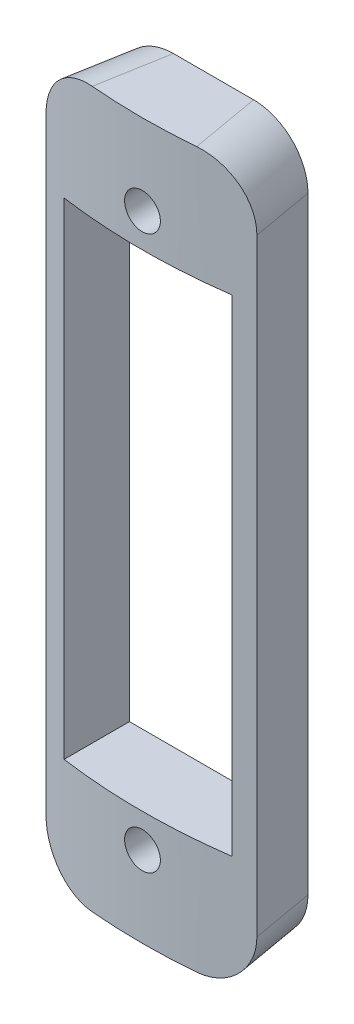
ISO-10303-21;
HEADER;
FILE_DESCRIPTION(('STEP AP214'),'2;1');
FILE_NAME('part.step','',(''),(''),'','','');
FILE_SCHEMA(('AUTOMOTIVE_DESIGN { 1 0 10303 214 1 1 1 1 }'));
ENDSEC;
DATA;
#1=APPLICATION_CONTEXT('core data for automotive mechanical design processes');
#2=APPLICATION_PROTOCOL_DEFINITION('international standard','automotive_design',2000,#1);
#3=PRODUCT_CONTEXT('',#1,'mechanical');
#4=PRODUCT('Part','Part','',(#3));
#5=PRODUCT_RELATED_PRODUCT_CATEGORY('part','',(#4));
#6=PRODUCT_DEFINITION_FORMATION('','',#4);
#7=PRODUCT_DEFINITION_CONTEXT('part definition',#1,'design');
#8=PRODUCT_DEFINITION('design','',#6,#7);
#9=PRODUCT_DEFINITION_SHAPE('','',#8);
#10=(LENGTH_UNIT() NAMED_UNIT(*) SI_UNIT(.MILLI.,.METRE.));
#11=(NAMED_UNIT(*) PLANE_ANGLE_UNIT() SI_UNIT($,.RADIAN.));
#12=(NAMED_UNIT(*) SI_UNIT($,.STERADIAN.) SOLID_ANGLE_UNIT());
#13=UNCERTAINTY_MEASURE_WITH_UNIT(LENGTH_MEASURE(1.E-05),#10,'distance_accuracy_value','');
#14=(GEOMETRIC_REPRESENTATION_CONTEXT(3) GLOBAL_UNCERTAINTY_ASSIGNED_CONTEXT((#13)) GLOBAL_UNIT_ASSIGNED_CONTEXT((#10,
#11,#12)) REPRESENTATION_CONTEXT('',''));
#15=CARTESIAN_POINT('',(0.,0.,0.));
#16=DIRECTION('',(0.,0.,1.));
#17=DIRECTION('',(1.,0.,0.));
#18=AXIS2_PLACEMENT_3D('',#15,#16,#17);
#19=CARTESIAN_POINT('',(5.8992627157898,40.,-0.516118610792767));
#20=DIRECTION('',(0.,-1.,0.));
#21=DIRECTION('',(0.,0.,-1.));
#22=AXIS2_PLACEMENT_3D('',#19,#20,#21);
#23=PLANE('',#22);
#24=CARTESIAN_POINT('',(0.,40.,-33.9725));
#25=DIRECTION('',(0.,-1.,0.));
#26=DIRECTION('',(0.,0.,-1.));
#27=AXIS2_PLACEMENT_3D('',#24,#25,#26);
#28=CIRCLE('',#27,33.9725);
#29=CARTESIAN_POINT('',(2.92179298812824,40.,-0.125877096311004));
#30=VERTEX_POINT('',#29);
#31=CARTESIAN_POINT('',(-2.92179298812824,40.,-0.125877096311004));
#32=VERTEX_POINT('',#31);
#33=EDGE_CURVE('E378',#30,#32,#28,.T.);
#34=ORIENTED_EDGE('',*,*,#33,.F.);
#35=DIRECTION('',(0.173648177666931,0.,0.984807753012208));
#36=VECTOR('',#35,1.);
#37=CARTESIAN_POINT('',(2.94483945675318,40.,0.00482592220802487));
#38=LINE('',#37,#36);
#39=CARTESIAN_POINT('',(2.24119605373601,40.,-3.98573411681718));
#40=VERTEX_POINT('',#39);
#41=EDGE_CURVE('E340',#30,#40,#38,.F.);
#42=ORIENTED_EDGE('',*,*,#41,.T.);
#43=DIRECTION('',(-1.,0.,0.));
#44=VECTOR('',#43,1.);
#45=CARTESIAN_POINT('',(5.55196636045594,40.,-3.98573411681718));
#46=LINE('',#45,#44);
#47=CARTESIAN_POINT('',(-2.24119605373601,40.,-3.98573411681718));
#48=VERTEX_POINT('',#47);
#49=EDGE_CURVE('E227',#40,#48,#46,.T.);
#50=ORIENTED_EDGE('',*,*,#49,.T.);
#51=DIRECTION('',(-0.173648177666931,0.,0.984807753012208));
#52=VECTOR('',#51,1.);
#53=CARTESIAN_POINT('',(-2.94483945675318,40.,0.00482592220802562));
#54=LINE('',#53,#52);
#55=EDGE_CURVE('E330',#48,#32,#54,.T.);
#56=ORIENTED_EDGE('',*,*,#55,.T.);
#57=EDGE_LOOP('',(#34,#42,#50,#56));
#58=FACE_BOUND('',#57,.T.);
#59=ADVANCED_FACE('F92',(#58),#23,.F.);
#60=CARTESIAN_POINT('',(5.8992627157898,0.,-0.516118610792767));
#61=DIRECTION('',(0.,1.,0.));
#62=DIRECTION('',(0.,0.,1.));
#63=AXIS2_PLACEMENT_3D('',#60,#61,#62);
#64=PLANE('',#63);
#65=DIRECTION('',(1.,0.,0.));
#66=VECTOR('',#65,1.);
#67=CARTESIAN_POINT('',(-5.55196636045594,0.,-3.98573411681718));
#68=LINE('',#67,#66);
#69=CARTESIAN_POINT('',(-2.24119605373601,0.,-3.98573411681718));
#70=VERTEX_POINT('',#69);
#71=CARTESIAN_POINT('',(2.24119605373601,0.,-3.98573411681718));
#72=VERTEX_POINT('',#71);
#73=EDGE_CURVE('E223',#70,#72,#68,.T.);
#74=ORIENTED_EDGE('',*,*,#73,.T.);
#75=DIRECTION('',(-0.173648177666931,0.,-0.984807753012208));
#76=VECTOR('',#75,1.);
#77=CARTESIAN_POINT('',(2.94483945675318,0.,0.00482592220802497));
#78=LINE('',#77,#76);
#79=CARTESIAN_POINT('',(2.92179298812824,0.,-0.125877096311004));
#80=VERTEX_POINT('',#79);
#81=EDGE_CURVE('E358',#72,#80,#78,.F.);
#82=ORIENTED_EDGE('',*,*,#81,.T.);
#83=CARTESIAN_POINT('',(0.,0.,-33.9725));
#84=DIRECTION('',(0.,-1.,0.));
#85=DIRECTION('',(0.,0.,-1.));
#86=AXIS2_PLACEMENT_3D('',#83,#84,#85);
#87=CIRCLE('',#86,33.9725);
#88=CARTESIAN_POINT('',(-2.92179298812824,0.,-0.125877096311004));
#89=VERTEX_POINT('',#88);
#90=EDGE_CURVE('E382',#80,#89,#87,.T.);
#91=ORIENTED_EDGE('',*,*,#90,.T.);
#92=DIRECTION('',(0.173648177666931,0.,-0.984807753012208));
#93=VECTOR('',#92,1.);
#94=CARTESIAN_POINT('',(-2.33305263035662,0.,-3.46478958381639));
#95=LINE('',#94,#93);
#96=EDGE_CURVE('E354',#89,#70,#95,.T.);
#97=ORIENTED_EDGE('',*,*,#96,.T.);
#98=EDGE_LOOP('',(#74,#82,#91,#97));
#99=FACE_BOUND('',#98,.T.);
#100=ADVANCED_FACE('F305',(#99),#64,.F.);
#101=CARTESIAN_POINT('',(0.,0.,-3.98573411681718));
#102=DIRECTION('',(0.,0.,1.));
#103=DIRECTION('',(1.,0.,0.));
#104=AXIS2_PLACEMENT_3D('',#101,#102,#103);
#105=PLANE('',#104);
#106=DIRECTION('',(0.,-1.,0.));
#107=VECTOR('',#106,1.);
#108=CARTESIAN_POINT('',(-4.7,33.6,-3.98573411681718));
#109=LINE('',#108,#107);
#110=CARTESIAN_POINT('',(-4.7,33.6,-3.98573411681718));
#111=VERTEX_POINT('',#110);
#112=CARTESIAN_POINT('',(-4.7,6.4,-3.98573411681718));
#113=VERTEX_POINT('',#112);
#114=EDGE_CURVE('E209',#111,#113,#109,.T.);
#115=ORIENTED_EDGE('',*,*,#114,.T.);
#116=DIRECTION('',(1.,0.,0.));
#117=VECTOR('',#116,1.);
#118=CARTESIAN_POINT('',(4.7,6.4,-3.98573411681718));
#119=LINE('',#118,#117);
#120=CARTESIAN_POINT('',(4.7,6.4,-3.98573411681718));
#121=VERTEX_POINT('',#120);
#122=EDGE_CURVE('E186',#113,#121,#119,.T.);
#123=ORIENTED_EDGE('',*,*,#122,.T.);
#124=DIRECTION('',(0.,1.,0.));
#125=VECTOR('',#124,1.);
#126=CARTESIAN_POINT('',(4.7,6.4,-3.98573411681718));
#127=LINE('',#126,#125);
#128=CARTESIAN_POINT('',(4.7,33.6,-3.98573411681718));
#129=VERTEX_POINT('',#128);
#130=EDGE_CURVE('E197',#121,#129,#127,.T.);
#131=ORIENTED_EDGE('',*,*,#130,.T.);
#132=DIRECTION('',(-1.,0.,0.));
#133=VECTOR('',#132,1.);
#134=CARTESIAN_POINT('',(-4.7,33.6,-3.98573411681718));
#135=LINE('',#134,#133);
#136=EDGE_CURVE('E204',#129,#111,#135,.T.);
#137=ORIENTED_EDGE('',*,*,#136,.T.);
#138=EDGE_LOOP('',(#115,#123,#131,#137));
#139=FACE_BOUND('',#138,.T.);
#140=CARTESIAN_POINT('',(0.,4.52,-3.98573411681718));
#141=DIRECTION('',(0.,0.,1.));
#142=DIRECTION('',(1.,0.,0.));
#143=AXIS2_PLACEMENT_3D('',#140,#141,#142);
#144=CIRCLE('',#143,1.);
#145=CARTESIAN_POINT('',(1.,4.52,-3.98573411681718));
#146=VERTEX_POINT('',#145);
#147=EDGE_CURVE('E211',#146,#146,#144,.T.);
#148=ORIENTED_EDGE('',*,*,#147,.T.);
#149=EDGE_LOOP('',(#148));
#150=FACE_BOUND('',#149,.T.);
#151=CARTESIAN_POINT('',(0.,35.48,-3.98573411681718));
#152=DIRECTION('',(0.,0.,1.));
#153=DIRECTION('',(1.,0.,0.));
#154=AXIS2_PLACEMENT_3D('',#151,#152,#153);
#155=CIRCLE('',#154,1.);
#156=CARTESIAN_POINT('',(1.,35.48,-3.98573411681718));
#157=VERTEX_POINT('',#156);
#158=EDGE_CURVE('E215',#157,#157,#155,.T.);
#159=ORIENTED_EDGE('',*,*,#158,.T.);
#160=EDGE_LOOP('',(#159));
#161=FACE_BOUND('',#160,.T.);
#162=ORIENTED_EDGE('',*,*,#49,.F.);
#163=CARTESIAN_POINT('',(2.24119605373601,37.,-3.98573411681718));
#164=DIRECTION('',(0.,0.,1.));
#165=DIRECTION('',(1.,0.,0.));
#166=AXIS2_PLACEMENT_3D('',#163,#164,#165);
#167=ELLIPSE('',#166,3.04627983565724,3.);
#168=CARTESIAN_POINT('',(5.28747588939325,37.,-3.98573411681718));
#169=VERTEX_POINT('',#168);
#170=EDGE_CURVE('E351',#40,#169,#167,.F.);
#171=ORIENTED_EDGE('',*,*,#170,.T.);
#172=DIRECTION('',(0.,1.,0.));
#173=VECTOR('',#172,1.);
#174=CARTESIAN_POINT('',(5.28747588939325,0.,-3.98573411681718));
#175=LINE('',#174,#173);
#176=CARTESIAN_POINT('',(5.28747588939325,3.,-3.98573411681718));
#177=VERTEX_POINT('',#176);
#178=EDGE_CURVE('E375',#177,#169,#175,.T.);
#179=ORIENTED_EDGE('',*,*,#178,.F.);
#180=CARTESIAN_POINT('',(2.24119605373601,3.,-3.98573411681718));
#181=DIRECTION('',(0.,0.,1.));
#182=DIRECTION('',(-1.,0.,0.));
#183=AXIS2_PLACEMENT_3D('',#180,#181,#182);
#184=ELLIPSE('',#183,3.04627983565724,3.);
#185=EDGE_CURVE('E348',#177,#72,#184,.F.);
#186=ORIENTED_EDGE('',*,*,#185,.T.);
#187=ORIENTED_EDGE('',*,*,#73,.F.);
#188=CARTESIAN_POINT('',(-2.24119605373601,3.,-3.98573411681718));
#189=DIRECTION('',(0.,0.,1.));
#190=DIRECTION('',(-1.,0.,0.));
#191=AXIS2_PLACEMENT_3D('',#188,#189,#190);
#192=ELLIPSE('',#191,3.04627983565724,3.);
#193=CARTESIAN_POINT('',(-5.28747588939325,3.,-3.98573411681718));
#194=VERTEX_POINT('',#193);
#195=EDGE_CURVE('E115',#70,#194,#192,.F.);
#196=ORIENTED_EDGE('',*,*,#195,.T.);
#197=DIRECTION('',(0.,1.,0.));
#198=VECTOR('',#197,1.);
#199=CARTESIAN_POINT('',(-5.28747588939325,0.,-3.98573411681718));
#200=LINE('',#199,#198);
#201=CARTESIAN_POINT('',(-5.28747588939325,37.,-3.98573411681718));
#202=VERTEX_POINT('',#201);
#203=EDGE_CURVE('E402',#194,#202,#200,.T.);
#204=ORIENTED_EDGE('',*,*,#203,.T.);
#205=CARTESIAN_POINT('',(-2.24119605373601,37.,-3.98573411681718));
#206=DIRECTION('',(0.,0.,1.));
#207=DIRECTION('',(1.,0.,0.));
#208=AXIS2_PLACEMENT_3D('',#205,#206,#207);
#209=ELLIPSE('',#208,3.04627983565724,3.);
#210=EDGE_CURVE('E343',#202,#48,#209,.F.);
#211=ORIENTED_EDGE('',*,*,#210,.T.);
#212=EDGE_LOOP('',(#162,#171,#179,#186,#187,#196,#204,#211));
#213=FACE_BOUND('',#212,.T.);
#214=ADVANCED_FACE('F206',(#139,#150,#161,#213),#105,.F.);
#215=CARTESIAN_POINT('',(0.,0.,-33.9725));
#216=DIRECTION('',(0.,-1.,0.));
#217=DIRECTION('',(0.,0.,-1.));
#218=AXIS2_PLACEMENT_3D('',#215,#216,#217);
#219=CYLINDRICAL_SURFACE('',#218,33.9725);
#220=CARTESIAN_POINT('',(1.,35.48,-0.0147209758942016));
#221=CARTESIAN_POINT('',(0.999997513642162,35.4238426172876,-0.0147207772486396));
#222=CARTESIAN_POINT('',(0.995253644364402,35.3676448248555,-0.0145801748343808));
#223=CARTESIAN_POINT('',(0.976395740182226,35.2567978521181,-0.0140328208042375));
#224=CARTESIAN_POINT('',(0.962270509336456,35.2021506036215,-0.0136257511883826));
#225=CARTESIAN_POINT('',(0.925053147042624,35.0960265966731,-0.0125916153020489));
#226=CARTESIAN_POINT('',(0.9019653984144,35.0445483027836,-0.0119646565754347));
#227=CARTESIAN_POINT('',(0.847484652327377,34.9462125523766,-0.0105615256804575));
#228=CARTESIAN_POINT('',(0.816093683681188,34.8993539709106,-0.00978538997471263));
#229=CARTESIAN_POINT('',(0.745881165792307,34.8115525298163,-0.00817095606510032));
#230=CARTESIAN_POINT('',(0.707056832093307,34.7706118971037,-0.00733263463946269));
#231=CARTESIAN_POINT('',(0.623084481996299,34.6958272288234,-0.00568852558756451));
#232=CARTESIAN_POINT('',(0.577936214021219,34.6619834757158,-0.00488273925725016));
#233=CARTESIAN_POINT('',(0.48258951163078,34.6023499340298,-0.00339442114617365));
#234=CARTESIAN_POINT('',(0.432390255699609,34.5765614584071,-0.00271190946598493));
#235=CARTESIAN_POINT('',(0.328372412134007,34.5337790693573,-0.0015472558635044));
#236=CARTESIAN_POINT('',(0.274553838739761,34.5167851213305,-0.00106511315291554));
#237=CARTESIAN_POINT('',(0.164841683600013,34.4920789082108,-0.000355671617623023));
#238=CARTESIAN_POINT('',(0.108948711833175,34.4843639365717,-0.000128298481557475));
#239=CARTESIAN_POINT('',(-0.00333944496895131,34.4784263391499,4.62223614167893E-05));
#240=CARTESIAN_POINT('',(-0.0597346280409103,34.4802036762745,-6.62883665438905E-06));
#241=CARTESIAN_POINT('',(-0.17140801612731,34.4931979550707,-0.000386535316670693));
#242=CARTESIAN_POINT('',(-0.226686561614122,34.5044119735332,-0.000713505684362299));
#243=CARTESIAN_POINT('',(-0.334576152588927,34.535956768739,-0.00160470174853287));
#244=CARTESIAN_POINT('',(-0.387187192328861,34.5562875651266,-0.00216892795623681));
#245=CARTESIAN_POINT('',(-0.488257728179094,34.6054921504709,-0.0034711899241181));
#246=CARTESIAN_POINT('',(-0.536716571759385,34.6343672790309,-0.00420925293519447));
#247=CARTESIAN_POINT('',(-0.628099981967729,34.6998398694153,-0.00577600946583619));
#248=CARTESIAN_POINT('',(-0.671024536502323,34.7364373481138,-0.00660470318343931));
#249=CARTESIAN_POINT('',(-0.750137940842107,34.8163323177066,-0.00825969989522234));
#250=CARTESIAN_POINT('',(-0.78632422877812,34.8596323454792,-0.00908600186300282));
#251=CARTESIAN_POINT('',(-0.850914176343981,34.951694330728,-0.0106427406146315));
#252=CARTESIAN_POINT('',(-0.879317834704575,35.000456289095,-0.0113731773828452));
#253=CARTESIAN_POINT('',(-0.927535961753667,35.102059391384,-0.0126558021857537));
#254=CARTESIAN_POINT('',(-0.947350347722275,35.1549005745856,-0.0132079885037758));
#255=CARTESIAN_POINT('',(-0.977825821264725,35.263161496898,-0.0140717779453725));
#256=CARTESIAN_POINT('',(-0.988486932879301,35.318581229236,-0.0143833817008281));
#257=CARTESIAN_POINT('',(-1.00035008363069,35.4304037897771,-0.0147307570283451));
#258=CARTESIAN_POINT('',(-1.00155567165314,35.4868062411754,-0.0147666320879225));
#259=CARTESIAN_POINT('',(-0.994482800735035,35.5990127428704,-0.014558774916731));
#260=CARTESIAN_POINT('',(-0.986204352358743,35.6548167938335,-0.0143150429974158));
#261=CARTESIAN_POINT('',(-0.96040134386475,35.7642325101869,-0.0135755421869516));
#262=CARTESIAN_POINT('',(-0.942878396219444,35.817844556161,-0.0130798172502507));
#263=CARTESIAN_POINT('',(-0.899085439918979,35.9213660869634,-0.0118922511416479));
#264=CARTESIAN_POINT('',(-0.872815414361654,35.9712755646369,-0.0112004095907861));
#265=CARTESIAN_POINT('',(-0.812264869418253,36.0659915505663,-0.00969834913244756));
#266=CARTESIAN_POINT('',(-0.777981959834502,36.1107965302361,-0.00888809493022906));
#267=CARTESIAN_POINT('',(-0.702382324832499,36.1940163135018,-0.0072406750304402));
#268=CARTESIAN_POINT('',(-0.661065582024384,36.2324311012986,-0.00640350926634009));
#269=CARTESIAN_POINT('',(-0.572555918292329,36.3017918798079,-0.00479633946982905));
#270=CARTESIAN_POINT('',(-0.525361203365883,36.3327355817778,-0.00402635606452948));
#271=CARTESIAN_POINT('',(-0.426444448105355,36.3862601549503,-0.00264064258107694));
#272=CARTESIAN_POINT('',(-0.374722417768455,36.408841044619,-0.00202491216231541));
#273=CARTESIAN_POINT('',(-0.268227863127471,36.4449949927357,-0.00101721247804147));
#274=CARTESIAN_POINT('',(-0.213455842782291,36.4585695345703,-0.000625206365600659));
#275=CARTESIAN_POINT('',(-0.102408937124751,36.4763303213247,-0.000108998492124729));
#276=CARTESIAN_POINT('',(-0.0461340529782502,36.4805165735273,1.52034766553932E-05));
#277=CARTESIAN_POINT('',(0.0662982393001708,36.4793817753985,-1.81955587839371E-05));
#278=CARTESIAN_POINT('',(0.122455683907081,36.4740643321761,-0.000175689645835085));
#279=CARTESIAN_POINT('',(0.233080406536676,36.4540805020248,-0.000754524326980173));
#280=CARTESIAN_POINT('',(0.287547681211115,36.4394140965768,-0.00117586544372284));
#281=CARTESIAN_POINT('',(0.393247354690003,36.4011491485958,-0.00223493383786617));
#282=CARTESIAN_POINT('',(0.444479699086256,36.3775504558777,-0.00287266475357113));
#283=CARTESIAN_POINT('',(0.54225419556959,36.3220920996906,-0.00429265365963366));
#284=CARTESIAN_POINT('',(0.588796517732883,36.2902327359314,-0.00507490640621953));
#285=CARTESIAN_POINT('',(0.675886279350094,36.2191469538439,-0.0066960931632711));
#286=CARTESIAN_POINT('',(0.716432078781537,36.1799185267443,-0.00753504258896107));
#287=CARTESIAN_POINT('',(0.790373505772317,36.0952000725833,-0.00917510750592588));
#288=CARTESIAN_POINT('',(0.823767360094714,36.0497084972338,-0.00997621357611936));
#289=CARTESIAN_POINT('',(0.882462444289374,35.9537376478785,-0.0114505230955954));
#290=CARTESIAN_POINT('',(0.907758464509005,35.9032551902633,-0.0121236440944888));
#291=CARTESIAN_POINT('',(0.949486476358077,35.7987968579843,-0.0132645619209187));
#292=CARTESIAN_POINT('',(0.965929040217795,35.7448252365467,-0.0137326035161325));
#293=CARTESIAN_POINT('',(0.985125041780507,35.6554271446126,-0.0142854468762356));
#294=CARTESIAN_POINT('',(0.990696134445735,35.6205809631187,-0.0144480609164975));
#295=CARTESIAN_POINT('',(0.998134393496357,35.5504951632566,-0.014665887764978));
#296=CARTESIAN_POINT('',(1.0000015609328,35.5152555450001,-0.0147211006036736));
#297=CARTESIAN_POINT('',(1.,35.48,-0.0147209758942016));
#298=B_SPLINE_CURVE_WITH_KNOTS('',3,(#220,#221,#222,#223,#224,#225,#226,#227,#228,#229,#230,
#231,#232,#233,#234,#235,#236,#237,#238,#239,#240,#241,#242,#243,#244,#245,#246,#247,#248,#249,
#250,#251,#252,#253,#254,#255,#256,#257,#258,#259,#260,#261,#262,#263,#264,#265,#266,#267,#268,
#269,#270,#271,#272,#273,#274,#275,#276,#277,#278,#279,#280,#281,#282,#283,#284,#285,#286,#287,
#288,#289,#290,#291,#292,#293,#294,#295,#296,#297),.UNSPECIFIED.,.T.,.F.,(4,2,2,2,2,2,2,2,2,2,2,
2,2,2,2,2,2,2,2,2,2,2,2,2,2,2,2,2,2,2,2,2,2,2,2,2,2,2,4),(0.,0.168343460933306,
0.336888188856507,0.505350599229996,0.673771885383047,0.842256384156517,1.01074758744013,
1.17926623933845,1.34778422823983,1.51625305089438,1.68472121523134,1.85313721223928,
2.021553572142,2.18999635081987,2.35843949757052,2.52694655573396,2.69545364137888,
2.86396234981295,3.03247061566382,3.200915633278,3.3693604632617,3.53777592195409,
3.70619170608116,3.87465779193781,4.04312429430204,4.21164234052683,4.38016001464085,
4.54864992622871,4.71713970711302,4.88556555161147,5.05399172974199,5.22242073987317,
5.39084363999399,5.55931251818855,5.72782311794003,5.89644191027871,6.06485889977861,
6.17054477507947,6.27623062039023),.UNSPECIFIED.);
#299=CARTESIAN_POINT('',(1.,35.48,-0.0147209758942016));
#300=VERTEX_POINT('',#299);
#301=EDGE_CURVE('E261',#300,#300,#298,.T.);
#302=ORIENTED_EDGE('',*,*,#301,.T.);
#303=EDGE_LOOP('',(#302));
#304=FACE_BOUND('',#303,.T.);
#305=CARTESIAN_POINT('',(1.,4.52,-0.0147209758942016));
#306=CARTESIAN_POINT('',(0.999997513642161,4.46384261728761,-0.0147207772486396));
#307=CARTESIAN_POINT('',(0.995253644364402,4.40764482485545,-0.0145801748343808));
#308=CARTESIAN_POINT('',(0.976395740182224,4.29679785211811,-0.0140328208042375));
#309=CARTESIAN_POINT('',(0.962270509336455,4.24215060362154,-0.0136257511883826));
#310=CARTESIAN_POINT('',(0.925053147042623,4.13602659667314,-0.0125916153020489));
#311=CARTESIAN_POINT('',(0.901965398414401,4.0845483027836,-0.0119646565754347));
#312=CARTESIAN_POINT('',(0.847484652327378,3.98621255237662,-0.0105615256804575));
#313=CARTESIAN_POINT('',(0.816093683681188,3.93935397091065,-0.00978538997471265));
#314=CARTESIAN_POINT('',(0.745881165792305,3.85155252981631,-0.0081709560651003));
#315=CARTESIAN_POINT('',(0.707056832093305,3.81061189710367,-0.00733263463946267));
#316=CARTESIAN_POINT('',(0.623084481996297,3.73582722882344,-0.0056885255875645));
#317=CARTESIAN_POINT('',(0.577936214021218,3.70198347571584,-0.00488273925725016));
#318=CARTESIAN_POINT('',(0.482589511630779,3.64234993402976,-0.00339442114617367));
#319=CARTESIAN_POINT('',(0.432390255699608,3.6165614584071,-0.00271190946598494));
#320=CARTESIAN_POINT('',(0.328372412134006,3.57377906935732,-0.00154725586350442));
#321=CARTESIAN_POINT('',(0.27455383873976,3.55678512133047,-0.00106511315291557));
#322=CARTESIAN_POINT('',(0.164841683600013,3.5320789082108,-0.000355671617623064));
#323=CARTESIAN_POINT('',(0.108948711833174,3.52436393657167,-0.000128298481557518));
#324=CARTESIAN_POINT('',(-0.00333944496895248,3.51842633914986,4.62223614167413E-05));
#325=CARTESIAN_POINT('',(-0.0597346280409114,3.52020367627451,-6.62883665443837E-06));
#326=CARTESIAN_POINT('',(-0.17140801612731,3.53319795507072,-0.000386535316670734));
#327=CARTESIAN_POINT('',(-0.226686561614122,3.54441197353321,-0.00071350568436233));
#328=CARTESIAN_POINT('',(-0.334576152588927,3.57595676873903,-0.00160470174853289));
#329=CARTESIAN_POINT('',(-0.387187192328861,3.59628756512665,-0.00216892795623684));
#330=CARTESIAN_POINT('',(-0.488257728179093,3.64549215047087,-0.00347118992411817));
#331=CARTESIAN_POINT('',(-0.536716571759385,3.67436727903095,-0.00420925293519457));
#332=CARTESIAN_POINT('',(-0.628099981967728,3.73983986941527,-0.00577600946583631));
#333=CARTESIAN_POINT('',(-0.671024536502322,3.77643734811383,-0.00660470318343941));
#334=CARTESIAN_POINT('',(-0.750137940842106,3.85633231770661,-0.00825969989522231));
#335=CARTESIAN_POINT('',(-0.786324228778117,3.89963234547919,-0.00908600186300266));
#336=CARTESIAN_POINT('',(-0.850914176343978,3.99169433072799,-0.0106427406146311));
#337=CARTESIAN_POINT('',(-0.879317834704573,4.04045628909497,-0.0113731773828448));
#338=CARTESIAN_POINT('',(-0.927535961753666,4.14205939138395,-0.0126558021857541));
#339=CARTESIAN_POINT('',(-0.947350347722274,4.19490057458557,-0.0132079885037771));
#340=CARTESIAN_POINT('',(-0.977825821264724,4.30316149689804,-0.014071777945373));
#341=CARTESIAN_POINT('',(-0.9884869328793,4.35858122923602,-0.014383381700827));
#342=CARTESIAN_POINT('',(-1.00035008363069,4.47040378977712,-0.0147307570283462));
#343=CARTESIAN_POINT('',(-1.00155567165314,4.52680624117542,-0.0147666320879273));
#344=CARTESIAN_POINT('',(-0.994482800735034,4.63901274287038,-0.0145587749167317));
#345=CARTESIAN_POINT('',(-0.986204352358742,4.69481679383354,-0.0143150429974089));
#346=CARTESIAN_POINT('',(-0.96040134386475,4.80423251018686,-0.0135755421869447));
#347=CARTESIAN_POINT('',(-0.942878396219445,4.85784455616099,-0.0130798172502515));
#348=CARTESIAN_POINT('',(-0.899085439918978,4.96136608696339,-0.0118922511416527));
#349=CARTESIAN_POINT('',(-0.872815414361652,5.01127556463689,-0.0112004095907871));
#350=CARTESIAN_POINT('',(-0.812264869418251,5.10599155056628,-0.00969834913244644));
#351=CARTESIAN_POINT('',(-0.777981959834501,5.1507965302361,-0.0088880949302295));
#352=CARTESIAN_POINT('',(-0.702382324832499,5.23401631350181,-0.00724067503044154));
#353=CARTESIAN_POINT('',(-0.661065582024385,5.27243110129865,-0.00640350926634078));
#354=CARTESIAN_POINT('',(-0.572555918292331,5.3417918798079,-0.00479633946982846));
#355=CARTESIAN_POINT('',(-0.525361203365886,5.37273558177777,-0.00402635606452824));
#356=CARTESIAN_POINT('',(-0.426444448105359,5.42626015495028,-0.00264064258107787));
#357=CARTESIAN_POINT('',(-0.374722417768459,5.44884104461904,-0.00202491216231913));
#358=CARTESIAN_POINT('',(-0.268227863127474,5.48499499273574,-0.00101721247803784));
#359=CARTESIAN_POINT('',(-0.213455842782293,5.49856953457035,-0.000625206365586875));
#360=CARTESIAN_POINT('',(-0.102408937124753,5.51633032132471,-0.000108998492110903));
#361=CARTESIAN_POINT('',(-0.0461340529782509,5.52051657352729,1.5203476659104E-05));
#362=CARTESIAN_POINT('',(0.066298239300171,5.51938177539853,-1.81955587876177E-05));
#363=CARTESIAN_POINT('',(0.122455683907081,5.51406433217614,-0.000175689645836043));
#364=CARTESIAN_POINT('',(0.233080406536676,5.49408050202484,-0.000754524326979152));
#365=CARTESIAN_POINT('',(0.287547681211116,5.47941409657678,-0.00117586544372256));
#366=CARTESIAN_POINT('',(0.393247354690006,5.44114914859584,-0.00223493383786646));
#367=CARTESIAN_POINT('',(0.444479699086262,5.41755045587775,-0.00287266475357127));
#368=CARTESIAN_POINT('',(0.542254195569595,5.36209209969057,-0.00429265365963366));
#369=CARTESIAN_POINT('',(0.588796517732885,5.33023273593141,-0.00507490640621954));
#370=CARTESIAN_POINT('',(0.675886279350093,5.25914695384391,-0.0066960931632711));
#371=CARTESIAN_POINT('',(0.716432078781536,5.21991852674426,-0.00753504258896105));
#372=CARTESIAN_POINT('',(0.790373505772318,5.13520007258331,-0.00917510750592588));
#373=CARTESIAN_POINT('',(0.823767360094714,5.08970849723382,-0.00997621357611937));
#374=CARTESIAN_POINT('',(0.882462444289374,4.99373764787854,-0.0114505230955954));
#375=CARTESIAN_POINT('',(0.907758464509003,4.9432551902633,-0.0121236440944887));
#376=CARTESIAN_POINT('',(0.949486476358075,4.83879685798427,-0.0132645619209186));
#377=CARTESIAN_POINT('',(0.965929040217793,4.78482523654672,-0.0137326035161324));
#378=CARTESIAN_POINT('',(0.985125041780506,4.69542714461258,-0.0142854468762356));
#379=CARTESIAN_POINT('',(0.990696134445734,4.66058096311867,-0.0144480609164974));
#380=CARTESIAN_POINT('',(0.998134393496357,4.59049516325659,-0.014665887764978));
#381=CARTESIAN_POINT('',(1.0000015609328,4.55525554500006,-0.0147211006036736));
#382=CARTESIAN_POINT('',(1.,4.52,-0.0147209758942016));
#383=B_SPLINE_CURVE_WITH_KNOTS('',3,(#305,#306,#307,#308,#309,#310,#311,#312,#313,#314,#315,
#316,#317,#318,#319,#320,#321,#322,#323,#324,#325,#326,#327,#328,#329,#330,#331,#332,#333,#334,
#335,#336,#337,#338,#339,#340,#341,#342,#343,#344,#345,#346,#347,#348,#349,#350,#351,#352,#353,
#354,#355,#356,#357,#358,#359,#360,#361,#362,#363,#364,#365,#366,#367,#368,#369,#370,#371,#372,
#373,#374,#375,#376,#377,#378,#379,#380,#381,#382),.UNSPECIFIED.,.T.,.F.,(4,2,2,2,2,2,2,2,2,2,2,
2,2,2,2,2,2,2,2,2,2,2,2,2,2,2,2,2,2,2,2,2,2,2,2,2,2,2,4),(0.,0.168343460933311,
0.336888188856507,0.505350599229994,0.673771885383048,0.842256384156519,1.01074758744013,
1.17926623933845,1.34778422823983,1.51625305089438,1.68472121523134,1.85313721223928,
2.021553572142,2.18999635081987,2.35843949757052,2.52694655573396,2.69545364137888,
2.86396234981294,3.03247061566382,3.200915633278,3.36936046326169,3.53777592195408,
3.70619170608116,3.87465779193781,4.04312429430203,4.21164234052683,4.38016001464085,
4.5486499262287,4.71713970711302,4.88556555161147,5.05399172974199,5.22242073987318,
5.39084363999399,5.55931251818854,5.72782311794003,5.8964419102787,6.0648588997786,
6.17054477507947,6.27623062039023),.UNSPECIFIED.);
#384=CARTESIAN_POINT('',(1.,4.52,-0.0147209758942016));
#385=VERTEX_POINT('',#384);
#386=EDGE_CURVE('E252',#385,#385,#383,.T.);
#387=ORIENTED_EDGE('',*,*,#386,.T.);
#388=EDGE_LOOP('',(#387));
#389=FACE_BOUND('',#388,.T.);
#390=CARTESIAN_POINT('',(0.,6.4,-33.9725));
#391=DIRECTION('',(0.,-1.,0.));
#392=DIRECTION('',(0.,0.,-1.));
#393=AXIS2_PLACEMENT_3D('',#390,#391,#392);
#394=CIRCLE('',#393,33.9725);
#395=CARTESIAN_POINT('',(4.7,6.4,-0.326686646032769));
#396=VERTEX_POINT('',#395);
#397=CARTESIAN_POINT('',(-4.7,6.4,-0.326686646032769));
#398=VERTEX_POINT('',#397);
#399=EDGE_CURVE('E189',#396,#398,#394,.T.);
#400=ORIENTED_EDGE('',*,*,#399,.T.);
#401=DIRECTION('',(0.,-1.,0.));
#402=VECTOR('',#401,1.);
#403=CARTESIAN_POINT('',(-4.7,0.,-0.326686646032769));
#404=LINE('',#403,#402);
#405=CARTESIAN_POINT('',(-4.7,33.6,-0.326686646032769));
#406=VERTEX_POINT('',#405);
#407=EDGE_CURVE('E248',#398,#406,#404,.F.);
#408=ORIENTED_EDGE('',*,*,#407,.T.);
#409=CARTESIAN_POINT('',(0.,33.6,-33.9725));
#410=DIRECTION('',(0.,1.,0.));
#411=DIRECTION('',(0.,0.,1.));
#412=AXIS2_PLACEMENT_3D('',#409,#410,#411);
#413=CIRCLE('',#412,33.9725);
#414=CARTESIAN_POINT('',(4.7,33.6,-0.326686646032769));
#415=VERTEX_POINT('',#414);
#416=EDGE_CURVE('E244',#406,#415,#413,.T.);
#417=ORIENTED_EDGE('',*,*,#416,.T.);
#418=DIRECTION('',(0.,-1.,0.));
#419=VECTOR('',#418,1.);
#420=CARTESIAN_POINT('',(4.7,0.,-0.326686646032769));
#421=LINE('',#420,#419);
#422=EDGE_CURVE('E241',#415,#396,#421,.T.);
#423=ORIENTED_EDGE('',*,*,#422,.T.);
#424=EDGE_LOOP('',(#400,#408,#417,#423));
#425=FACE_BOUND('',#424,.T.);
#426=DIRECTION('',(0.,-1.,0.));
#427=VECTOR('',#426,1.);
#428=CARTESIAN_POINT('',(5.8992627157898,0.,-0.516118610792767));
#429=LINE('',#428,#427);
#430=CARTESIAN_POINT('',(5.8992627157898,37.,-0.516118610792767));
#431=VERTEX_POINT('',#430);
#432=CARTESIAN_POINT('',(5.8992627157898,3.,-0.516118610792767));
#433=VERTEX_POINT('',#432);
#434=EDGE_CURVE('E386',#431,#433,#429,.T.);
#435=ORIENTED_EDGE('',*,*,#434,.F.);
#436=CARTESIAN_POINT('',(5.8992627157898,37.,-0.516118610792767));
#437=CARTESIAN_POINT('',(5.89927026831622,37.0843733474343,-0.516122319768381));
#438=CARTESIAN_POINT('',(5.89575737833562,37.1687428622209,-0.515500587288542));
#439=CARTESIAN_POINT('',(5.88174934983913,37.3368783615977,-0.513033873359336));
#440=CARTESIAN_POINT('',(5.87125454395178,37.4206443747475,-0.51118895018455));
#441=CARTESIAN_POINT('',(5.84335166483331,37.5869234491748,-0.506305296290063));
#442=CARTESIAN_POINT('',(5.82594872668129,37.6694373939683,-0.50326745233202));
#443=CARTESIAN_POINT('',(5.78436490674474,37.8326637460411,-0.496055746728198));
#444=CARTESIAN_POINT('',(5.7601841077394,37.9133761753098,-0.491881898956652));
#445=CARTESIAN_POINT('',(5.67765900605228,38.1520331311812,-0.477752478490233));
#446=CARTESIAN_POINT('',(5.60932071339511,38.3065642858684,-0.466186988966719));
#447=CARTESIAN_POINT('',(5.44796314460977,38.6016817228294,-0.439574510733207));
#448=CARTESIAN_POINT('',(5.35494818582904,38.7422704385205,-0.424528131087048));
#449=CARTESIAN_POINT('',(5.14678783450308,39.0056059056591,-0.391964023289901));
#450=CARTESIAN_POINT('',(5.03164988637482,39.1283586346075,-0.374447126997148));
#451=CARTESIAN_POINT('',(4.78238642273588,39.3525771390435,-0.338062837949612));
#452=CARTESIAN_POINT('',(4.64825781951995,39.4540394462334,-0.319195225828014));
#453=CARTESIAN_POINT('',(4.36496177762985,39.6326741538592,-0.281280887169035));
#454=CARTESIAN_POINT('',(4.21581230073441,39.7098751208303,-0.262234398683156));
#455=CARTESIAN_POINT('',(3.90655023895726,39.8379675637863,-0.22499916984343));
#456=CARTESIAN_POINT('',(3.74644353315169,39.8888730251583,-0.206809978220107));
#457=CARTESIAN_POINT('',(3.47479730116335,39.9505811257977,-0.177996723668004));
#458=CARTESIAN_POINT('',(3.3650006494114,39.9691098925069,-0.166883163122236));
#459=CARTESIAN_POINT('',(3.14409727017008,39.9938181033657,-0.14561970023913));
#460=CARTESIAN_POINT('',(3.03299267662478,40.0000154413986,-0.135468421969697));
#461=CARTESIAN_POINT('',(2.92179298812824,40.,-0.125877096311003));
#462=B_SPLINE_CURVE_WITH_KNOTS('',3,(#436,#437,#438,#439,#440,#441,#442,#443,#444,#445,#446,
#447,#448,#449,#450,#451,#452,#453,#454,#455,#456,#457,#458,#459,#460,#461),.UNSPECIFIED.,.F.,
.F.,(4,2,2,2,2,2,2,2,2,2,2,2,4),(0.,0.253037735687418,0.506063417155873,0.758901366106186,
1.01173622723672,1.5172047118308,2.02258481959359,2.52779516313007,3.03308774373636,
3.5377831184978,4.04220979157805,4.37726848095255,4.71184061793286),.UNSPECIFIED.);
#463=EDGE_CURVE('E322',#431,#30,#462,.T.);
#464=ORIENTED_EDGE('',*,*,#463,.T.);
#465=ORIENTED_EDGE('',*,*,#33,.T.);
#466=CARTESIAN_POINT('',(-2.92179298812824,40.,-0.125877096311004));
#467=CARTESIAN_POINT('',(-3.00582891874909,40.0000081575164,-0.133128415943753));
#468=CARTESIAN_POINT('',(-3.08983461633985,39.9964704515455,-0.14069844683584));
#469=CARTESIAN_POINT('',(-3.25719698160922,39.9823517524598,-0.156402732157342));
#470=CARTESIAN_POINT('',(-3.34055366387662,39.9717709181281,-0.164536973863253));
#471=CARTESIAN_POINT('',(-3.50597540604313,39.9436242448778,-0.181290954215051));
#472=CARTESIAN_POINT('',(-3.58804132855992,39.9260632966366,-0.189910349311983));
#473=CARTESIAN_POINT('',(-3.75033260973999,39.8840878659101,-0.2075412648195));
#474=CARTESIAN_POINT('',(-3.83055800577492,39.8596735227158,-0.21655277725741));
#475=CARTESIAN_POINT('',(-4.06772155948354,39.7763255694092,-0.244031074071315));
#476=CARTESIAN_POINT('',(-4.22119320662529,39.7072791570331,-0.262946336919802));
#477=CARTESIAN_POINT('',(-4.51409467268287,39.5442525485931,-0.300915569322912));
#478=CARTESIAN_POINT('',(-4.65352751520145,39.45027773739,-0.319969508058252));
#479=CARTESIAN_POINT('',(-4.91432388637295,39.2402360409613,-0.357064530584352));
#480=CARTESIAN_POINT('',(-5.03572384363509,39.1242148040683,-0.375107609183531));
#481=CARTESIAN_POINT('',(-5.25743613596226,38.8732164856547,-0.409086241271523));
#482=CARTESIAN_POINT('',(-5.35774401861326,38.7382354118335,-0.425021349517299));
#483=CARTESIAN_POINT('',(-5.53459654255178,38.4530231966379,-0.453743165182121));
#484=CARTESIAN_POINT('',(-5.61111548400519,38.3027757934523,-0.466526464554363));
#485=CARTESIAN_POINT('',(-5.73813319300283,37.9914287980885,-0.488044521766698));
#486=CARTESIAN_POINT('',(-5.78864670209677,37.8303354128069,-0.496781572997412));
#487=CARTESIAN_POINT('',(-5.85000517762887,37.5569176872712,-0.507461305212942));
#488=CARTESIAN_POINT('',(-5.8684658842102,37.4462906763299,-0.510698883010189));
#489=CARTESIAN_POINT('',(-5.89309311626752,37.2237910733146,-0.515030684681655));
#490=CARTESIAN_POINT('',(-5.89927667049078,37.1119204232336,-0.516127877291909));
#491=CARTESIAN_POINT('',(-5.8992627157898,37.,-0.516118610792768));
#492=B_SPLINE_CURVE_WITH_KNOTS('',3,(#466,#467,#468,#469,#470,#471,#472,#473,#474,#475,#476,
#477,#478,#479,#480,#481,#482,#483,#484,#485,#486,#487,#488,#489,#490,#491),.UNSPECIFIED.,.F.,
.F.,(4,2,2,2,2,2,2,2,2,2,2,2,4),(0.,0.25296455508494,0.505923407425375,0.758705333499075,
1.01148212231553,1.51689639405263,2.02220157846435,2.52647168190699,3.03084812720187,
3.53576758554163,4.04040050706491,4.37635528190719,4.71184375181693),.UNSPECIFIED.);
#493=CARTESIAN_POINT('',(-5.8992627157898,37.,-0.516118610792766));
#494=VERTEX_POINT('',#493);
#495=EDGE_CURVE('E365',#32,#494,#492,.T.);
#496=ORIENTED_EDGE('',*,*,#495,.T.);
#497=DIRECTION('',(0.,-1.,0.));
#498=VECTOR('',#497,1.);
#499=CARTESIAN_POINT('',(-5.8992627157898,0.,-0.516118610792766));
#500=LINE('',#499,#498);
#501=CARTESIAN_POINT('',(-5.8992627157898,3.,-0.516118610792766));
#502=VERTEX_POINT('',#501);
#503=EDGE_CURVE('E390',#494,#502,#500,.T.);
#504=ORIENTED_EDGE('',*,*,#503,.T.);
#505=CARTESIAN_POINT('',(-5.8992627157898,3.,-0.516118610792766));
#506=CARTESIAN_POINT('',(-5.89927026831622,2.91562665256575,-0.516122319768376));
#507=CARTESIAN_POINT('',(-5.89575737833562,2.83125713777912,-0.515500587288537));
#508=CARTESIAN_POINT('',(-5.88174934983913,2.66312163840227,-0.513033873359333));
#509=CARTESIAN_POINT('',(-5.87125454395178,2.57935562525253,-0.51118895018455));
#510=CARTESIAN_POINT('',(-5.84335166483331,2.41307655082517,-0.506305296290062));
#511=CARTESIAN_POINT('',(-5.8259487266813,2.33056260603173,-0.503267452332014));
#512=CARTESIAN_POINT('',(-5.78436490674474,2.16733625395887,-0.496055746728195));
#513=CARTESIAN_POINT('',(-5.7601841077394,2.08662382469022,-0.491881898956656));
#514=CARTESIAN_POINT('',(-5.67765900605228,1.84796686881883,-0.477752478490245));
#515=CARTESIAN_POINT('',(-5.60932071339511,1.69343571413158,-0.466186988966725));
#516=CARTESIAN_POINT('',(-5.44796314460977,1.39831827717065,-0.439574510733207));
#517=CARTESIAN_POINT('',(-5.35494818582904,1.25772956147952,-0.424528131087048));
#518=CARTESIAN_POINT('',(-5.14678783450308,0.994394094340873,-0.391964023289899));
#519=CARTESIAN_POINT('',(-5.03164988637482,0.87164136539252,-0.374447126997145));
#520=CARTESIAN_POINT('',(-4.78238642273588,0.647422860956501,-0.33806283794961));
#521=CARTESIAN_POINT('',(-4.64825781951995,0.545960553766574,-0.319195225828014));
#522=CARTESIAN_POINT('',(-4.36496177762985,0.36732584614077,-0.281280887169033));
#523=CARTESIAN_POINT('',(-4.21581230073441,0.290124879169655,-0.26223439868315));
#524=CARTESIAN_POINT('',(-3.90655023895726,0.162032436213741,-0.224999169843429));
#525=CARTESIAN_POINT('',(-3.74644353315169,0.111126974841688,-0.206809978220114));
#526=CARTESIAN_POINT('',(-3.47479730116335,0.049418874202343,-0.177996723668009));
#527=CARTESIAN_POINT('',(-3.3650006494114,0.0308901074931515,-0.166883163122237));
#528=CARTESIAN_POINT('',(-3.14409727017009,0.00618189663431915,-0.145619700239125));
#529=CARTESIAN_POINT('',(-3.03299267662478,-1.54413986479504E-05,-0.13546842196969));
#530=CARTESIAN_POINT('',(-2.92179298812824,0.,-0.125877096311002));
#531=B_SPLINE_CURVE_WITH_KNOTS('',3,(#505,#506,#507,#508,#509,#510,#511,#512,#513,#514,#515,
#516,#517,#518,#519,#520,#521,#522,#523,#524,#525,#526,#527,#528,#529,#530),.UNSPECIFIED.,.F.,
.F.,(4,2,2,2,2,2,2,2,2,2,2,2,4),(0.,0.253037735687418,0.506063417155866,0.758901366106179,
1.01173622723672,1.51720471183079,2.02258481959359,2.52779516313007,3.03308774373636,
3.53778311849779,4.04220979157805,4.37726848095255,4.71184061793286),.UNSPECIFIED.);
#532=EDGE_CURVE('E363',#502,#89,#531,.T.);
#533=ORIENTED_EDGE('',*,*,#532,.T.);
#534=ORIENTED_EDGE('',*,*,#90,.F.);
#535=CARTESIAN_POINT('',(2.92179298812824,0.,-0.125877096311004));
#536=CARTESIAN_POINT('',(3.00582891874909,-8.15751636357615E-06,-0.133128415943753));
#537=CARTESIAN_POINT('',(3.08983461633985,0.00352954845450082,-0.14069844683584));
#538=CARTESIAN_POINT('',(3.25719698160921,0.0176482475402317,-0.156402732157342));
#539=CARTESIAN_POINT('',(3.34055366387662,0.0282290818718968,-0.164536973863253));
#540=CARTESIAN_POINT('',(3.50597540604312,0.0563757551221636,-0.181290954215051));
#541=CARTESIAN_POINT('',(3.58804132855992,0.0739367033634083,-0.189910349311983));
#542=CARTESIAN_POINT('',(3.75033260973999,0.115912134089862,-0.2075412648195));
#543=CARTESIAN_POINT('',(3.83055800577492,0.14032647728425,-0.21655277725741));
#544=CARTESIAN_POINT('',(4.06772155948353,0.223674430590813,-0.244031074071315));
#545=CARTESIAN_POINT('',(4.22119320662528,0.292720842966872,-0.262946336919802));
#546=CARTESIAN_POINT('',(4.51409467268287,0.455747451406855,-0.300915569322912));
#547=CARTESIAN_POINT('',(4.65352751520145,0.549722262610017,-0.319969508058252));
#548=CARTESIAN_POINT('',(4.91432388637295,0.759763959038669,-0.357064530584352));
#549=CARTESIAN_POINT('',(5.03572384363509,0.875785195931663,-0.375107609183531));
#550=CARTESIAN_POINT('',(5.25743613596226,1.12678351434532,-0.409086241271523));
#551=CARTESIAN_POINT('',(5.35774401861326,1.26176458816647,-0.425021349517299));
#552=CARTESIAN_POINT('',(5.53459654255178,1.54697680336213,-0.453743165182121));
#553=CARTESIAN_POINT('',(5.61111548400519,1.69722420654765,-0.466526464554364));
#554=CARTESIAN_POINT('',(5.73813319300283,2.00857120191149,-0.488044521766698));
#555=CARTESIAN_POINT('',(5.78864670209677,2.16966458719307,-0.49678157299741));
#556=CARTESIAN_POINT('',(5.85000517762887,2.44308231272879,-0.507461305212943));
#557=CARTESIAN_POINT('',(5.8684658842102,2.55370932367008,-0.510698883010193));
#558=CARTESIAN_POINT('',(5.89309311626752,2.77620892668542,-0.515030684681659));
#559=CARTESIAN_POINT('',(5.89927667049078,2.88807957676642,-0.516127877291912));
#560=CARTESIAN_POINT('',(5.8992627157898,3.,-0.516118610792761));
#561=B_SPLINE_CURVE_WITH_KNOTS('',3,(#535,#536,#537,#538,#539,#540,#541,#542,#543,#544,#545,
#546,#547,#548,#549,#550,#551,#552,#553,#554,#555,#556,#557,#558,#559,#560),.UNSPECIFIED.,.F.,
.F.,(4,2,2,2,2,2,2,2,2,2,2,2,4),(0.,0.25296455508494,0.505923407425374,0.758705333499076,
1.01148212231553,1.51689639405263,2.02220157846435,2.52647168190699,3.03084812720186,
3.53576758554163,4.04040050706491,4.37635528190719,4.71184375181693),.UNSPECIFIED.);
#562=EDGE_CURVE('E331',#80,#433,#561,.T.);
#563=ORIENTED_EDGE('',*,*,#562,.T.);
#564=EDGE_LOOP('',(#435,#464,#465,#496,#504,#533,#534,#563));
#565=FACE_BOUND('',#564,.T.);
#566=ADVANCED_FACE('F267',(#304,#389,#425,#565),#219,.T.);
#567=CARTESIAN_POINT('',(5.8992627157898,0.,-0.516118610792767));
#568=DIRECTION('',(-0.984807753012208,0.,0.173648177666931));
#569=DIRECTION('',(0.173648177666931,0.,0.984807753012208));
#570=AXIS2_PLACEMENT_3D('',#567,#568,#569);
#571=PLANE('',#570);
#572=ORIENTED_EDGE('',*,*,#178,.T.);
#573=DIRECTION('',(0.173648177666931,0.,0.984807753012208));
#574=VECTOR('',#573,1.);
#575=CARTESIAN_POINT('',(5.8992627157898,37.,-0.516118610792767));
#576=LINE('',#575,#574);
#577=EDGE_CURVE('E367',#169,#431,#576,.T.);
#578=ORIENTED_EDGE('',*,*,#577,.T.);
#579=ORIENTED_EDGE('',*,*,#434,.T.);
#580=DIRECTION('',(-0.173648177666931,0.,-0.984807753012208));
#581=VECTOR('',#580,1.);
#582=CARTESIAN_POINT('',(5.8992627157898,3.,-0.516118610792767));
#583=LINE('',#582,#581);
#584=EDGE_CURVE('E371',#433,#177,#583,.T.);
#585=ORIENTED_EDGE('',*,*,#584,.T.);
#586=EDGE_LOOP('',(#572,#578,#579,#585));
#587=FACE_BOUND('',#586,.T.);
#588=ADVANCED_FACE('F296',(#587),#571,.F.);
#589=CARTESIAN_POINT('',(-5.8992627157898,0.,-0.516118610792766));
#590=DIRECTION('',(-0.984807753012208,0.,-0.173648177666931));
#591=DIRECTION('',(-0.173648177666931,0.,0.984807753012208));
#592=AXIS2_PLACEMENT_3D('',#589,#590,#591);
#593=PLANE('',#592);
#594=ORIENTED_EDGE('',*,*,#203,.F.);
#595=DIRECTION('',(0.173648177666931,0.,-0.984807753012208));
#596=VECTOR('',#595,1.);
#597=CARTESIAN_POINT('',(-5.8992627157898,3.,-0.516118610792767));
#598=LINE('',#597,#596);
#599=EDGE_CURVE('E12',#194,#502,#598,.F.);
#600=ORIENTED_EDGE('',*,*,#599,.T.);
#601=ORIENTED_EDGE('',*,*,#503,.F.);
#602=DIRECTION('',(-0.173648177666931,0.,0.984807753012208));
#603=VECTOR('',#602,1.);
#604=CARTESIAN_POINT('',(-5.28747588939325,37.,-3.98573411681718));
#605=LINE('',#604,#603);
#606=EDGE_CURVE('E102',#494,#202,#605,.F.);
#607=ORIENTED_EDGE('',*,*,#606,.T.);
#608=EDGE_LOOP('',(#594,#600,#601,#607));
#609=FACE_BOUND('',#608,.T.);
#610=ADVANCED_FACE('F293',(#609),#593,.T.);
#611=CARTESIAN_POINT('',(-4.7,33.6,-2.48573411681718));
#612=DIRECTION('',(-1.,0.,0.));
#613=DIRECTION('',(0.,-1.,0.));
#614=AXIS2_PLACEMENT_3D('',#611,#612,#613);
#615=PLANE('',#614);
#616=DIRECTION('',(0.,0.,1.));
#617=VECTOR('',#616,1.);
#618=CARTESIAN_POINT('',(-4.7,6.4,-2.48573411681718));
#619=LINE('',#618,#617);
#620=EDGE_CURVE('E194',#113,#398,#619,.T.);
#621=ORIENTED_EDGE('',*,*,#620,.F.);
#622=ORIENTED_EDGE('',*,*,#114,.F.);
#623=DIRECTION('',(0.,0.,1.));
#624=VECTOR('',#623,1.);
#625=CARTESIAN_POINT('',(-4.7,33.6,-2.48573411681718));
#626=LINE('',#625,#624);
#627=EDGE_CURVE('E231',#111,#406,#626,.T.);
#628=ORIENTED_EDGE('',*,*,#627,.T.);
#629=ORIENTED_EDGE('',*,*,#407,.F.);
#630=EDGE_LOOP('',(#621,#622,#628,#629));
#631=FACE_BOUND('',#630,.T.);
#632=ADVANCED_FACE('F285',(#631),#615,.F.);
#633=CARTESIAN_POINT('',(-4.7,33.6,-2.48573411681718));
#634=DIRECTION('',(0.,1.,0.));
#635=DIRECTION('',(0.,0.,1.));
#636=AXIS2_PLACEMENT_3D('',#633,#634,#635);
#637=PLANE('',#636);
#638=ORIENTED_EDGE('',*,*,#627,.F.);
#639=ORIENTED_EDGE('',*,*,#136,.F.);
#640=DIRECTION('',(0.,0.,1.));
#641=VECTOR('',#640,1.);
#642=CARTESIAN_POINT('',(4.7,33.6,-2.48573411681718));
#643=LINE('',#642,#641);
#644=EDGE_CURVE('E193',#129,#415,#643,.T.);
#645=ORIENTED_EDGE('',*,*,#644,.T.);
#646=ORIENTED_EDGE('',*,*,#416,.F.);
#647=EDGE_LOOP('',(#638,#639,#645,#646));
#648=FACE_BOUND('',#647,.T.);
#649=ADVANCED_FACE('F282',(#648),#637,.F.);
#650=CARTESIAN_POINT('',(4.7,33.6,-2.48573411681718));
#651=DIRECTION('',(1.,0.,0.));
#652=DIRECTION('',(0.,1.,0.));
#653=AXIS2_PLACEMENT_3D('',#650,#651,#652);
#654=PLANE('',#653);
#655=ORIENTED_EDGE('',*,*,#644,.F.);
#656=ORIENTED_EDGE('',*,*,#130,.F.);
#657=DIRECTION('',(0.,0.,1.));
#658=VECTOR('',#657,1.);
#659=CARTESIAN_POINT('',(4.7,6.4,-2.48573411681718));
#660=LINE('',#659,#658);
#661=EDGE_CURVE('E182',#121,#396,#660,.T.);
#662=ORIENTED_EDGE('',*,*,#661,.T.);
#663=ORIENTED_EDGE('',*,*,#422,.F.);
#664=EDGE_LOOP('',(#655,#656,#662,#663));
#665=FACE_BOUND('',#664,.T.);
#666=ADVANCED_FACE('F198',(#665),#654,.F.);
#667=CARTESIAN_POINT('',(-4.7,6.4,-2.48573411681718));
#668=DIRECTION('',(0.,-1.,0.));
#669=DIRECTION('',(0.,0.,-1.));
#670=AXIS2_PLACEMENT_3D('',#667,#668,#669);
#671=PLANE('',#670);
#672=ORIENTED_EDGE('',*,*,#661,.F.);
#673=ORIENTED_EDGE('',*,*,#122,.F.);
#674=ORIENTED_EDGE('',*,*,#620,.T.);
#675=ORIENTED_EDGE('',*,*,#399,.F.);
#676=EDGE_LOOP('',(#672,#673,#674,#675));
#677=FACE_BOUND('',#676,.T.);
#678=ADVANCED_FACE('F184',(#677),#671,.F.);
#679=CARTESIAN_POINT('',(0.,4.52,-2.48573411681718));
#680=DIRECTION('',(0.,0.,1.));
#681=DIRECTION('',(1.,0.,0.));
#682=AXIS2_PLACEMENT_3D('',#679,#680,#681);
#683=CYLINDRICAL_SURFACE('',#682,1.);
#684=ORIENTED_EDGE('',*,*,#386,.F.);
#685=EDGE_LOOP('',(#684));
#686=FACE_BOUND('',#685,.T.);
#687=ORIENTED_EDGE('',*,*,#147,.F.);
#688=EDGE_LOOP('',(#687));
#689=FACE_BOUND('',#688,.T.);
#690=ADVANCED_FACE('F271',(#686,#689),#683,.F.);
#691=CARTESIAN_POINT('',(0.,35.48,-2.48573411681718));
#692=DIRECTION('',(0.,0.,1.));
#693=DIRECTION('',(1.,0.,0.));
#694=AXIS2_PLACEMENT_3D('',#691,#692,#693);
#695=CYLINDRICAL_SURFACE('',#694,1.);
#696=ORIENTED_EDGE('',*,*,#301,.F.);
#697=EDGE_LOOP('',(#696));
#698=FACE_BOUND('',#697,.T.);
#699=ORIENTED_EDGE('',*,*,#158,.F.);
#700=EDGE_LOOP('',(#699));
#701=FACE_BOUND('',#700,.T.);
#702=ADVANCED_FACE('F275',(#698,#701),#695,.F.);
#703=CARTESIAN_POINT('',(2.94483945675318,37.,0.00482592220802487));
#704=DIRECTION('',(0.173648177666931,0.,0.984807753012208));
#705=DIRECTION('',(0.984807753012208,0.,-0.173648177666931));
#706=AXIS2_PLACEMENT_3D('',#703,#704,#705);
#707=CYLINDRICAL_SURFACE('',#706,3.);
#708=ORIENTED_EDGE('',*,*,#170,.F.);
#709=ORIENTED_EDGE('',*,*,#41,.F.);
#710=ORIENTED_EDGE('',*,*,#463,.F.);
#711=ORIENTED_EDGE('',*,*,#577,.F.);
#712=EDGE_LOOP('',(#708,#709,#710,#711));
#713=FACE_BOUND('',#712,.T.);
#714=ADVANCED_FACE('F280',(#713),#707,.T.);
#715=CARTESIAN_POINT('',(2.94483945675318,3.,0.00482592220802487));
#716=DIRECTION('',(-0.173648177666931,0.,-0.984807753012208));
#717=DIRECTION('',(-0.984807753012208,0.,0.173648177666931));
#718=AXIS2_PLACEMENT_3D('',#715,#716,#717);
#719=CYLINDRICAL_SURFACE('',#718,3.);
#720=ORIENTED_EDGE('',*,*,#562,.F.);
#721=ORIENTED_EDGE('',*,*,#81,.F.);
#722=ORIENTED_EDGE('',*,*,#185,.F.);
#723=ORIENTED_EDGE('',*,*,#584,.F.);
#724=EDGE_LOOP('',(#720,#721,#722,#723));
#725=FACE_BOUND('',#724,.T.);
#726=ADVANCED_FACE('F318',(#725),#719,.T.);
#727=CARTESIAN_POINT('',(-2.58907038306849,3.,-2.01284075736218));
#728=DIRECTION('',(-0.173648177666931,0.,0.984807753012208));
#729=DIRECTION('',(0.984807753012208,0.,0.173648177666931));
#730=AXIS2_PLACEMENT_3D('',#727,#728,#729);
#731=CYLINDRICAL_SURFACE('',#730,3.);
#732=ORIENTED_EDGE('',*,*,#532,.F.);
#733=ORIENTED_EDGE('',*,*,#599,.F.);
#734=ORIENTED_EDGE('',*,*,#195,.F.);
#735=ORIENTED_EDGE('',*,*,#96,.F.);
#736=EDGE_LOOP('',(#732,#733,#734,#735));
#737=FACE_BOUND('',#736,.T.);
#738=ADVANCED_FACE('F424',(#737),#731,.T.);
#739=CARTESIAN_POINT('',(-2.58907038306849,37.,-2.01284075736218));
#740=DIRECTION('',(0.173648177666931,0.,-0.984807753012208));
#741=DIRECTION('',(-0.984807753012208,0.,-0.173648177666931));
#742=AXIS2_PLACEMENT_3D('',#739,#740,#741);
#743=CYLINDRICAL_SURFACE('',#742,3.);
#744=ORIENTED_EDGE('',*,*,#210,.F.);
#745=ORIENTED_EDGE('',*,*,#606,.F.);
#746=ORIENTED_EDGE('',*,*,#495,.F.);
#747=ORIENTED_EDGE('',*,*,#55,.F.);
#748=EDGE_LOOP('',(#744,#745,#746,#747));
#749=FACE_BOUND('',#748,.T.);
#750=ADVANCED_FACE('F94',(#749),#743,.T.);
#751=CLOSED_SHELL('',(#59,#100,#214,#566,#588,#610,#632,#649,#666,#678,#690,#702,#714,#726,#738,#750));
#752=MANIFOLD_SOLID_BREP('B2',#751);
#753=ADVANCED_BREP_SHAPE_REPRESENTATION('',(#18,#752),#14);
#754=SHAPE_DEFINITION_REPRESENTATION(#9,#753);
ENDSEC;
END-ISO-10303-21;
